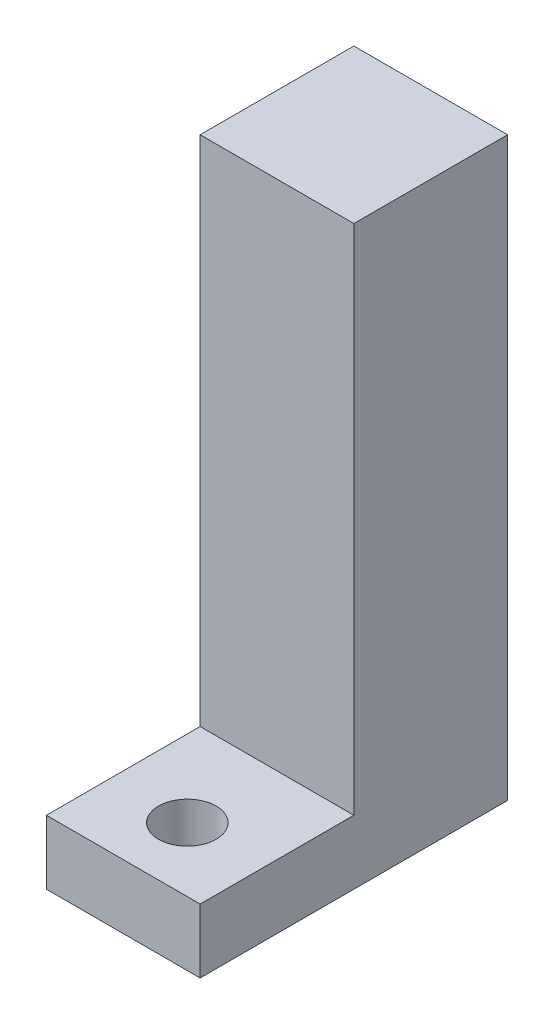
ISO-10303-21;
HEADER;
FILE_DESCRIPTION(('STEP AP214'),'2;1');
FILE_NAME('part.step','',(''),(''),'','','');
FILE_SCHEMA(('AUTOMOTIVE_DESIGN { 1 0 10303 214 1 1 1 1 }'));
ENDSEC;
DATA;
#1=APPLICATION_CONTEXT('core data for automotive mechanical design processes');
#2=APPLICATION_PROTOCOL_DEFINITION('international standard','automotive_design',2000,#1);
#3=PRODUCT_CONTEXT('',#1,'mechanical');
#4=PRODUCT('Part','Part','',(#3));
#5=PRODUCT_RELATED_PRODUCT_CATEGORY('part','',(#4));
#6=PRODUCT_DEFINITION_FORMATION('','',#4);
#7=PRODUCT_DEFINITION_CONTEXT('part definition',#1,'design');
#8=PRODUCT_DEFINITION('design','',#6,#7);
#9=PRODUCT_DEFINITION_SHAPE('','',#8);
#10=(LENGTH_UNIT() NAMED_UNIT(*) SI_UNIT(.MILLI.,.METRE.));
#11=(NAMED_UNIT(*) PLANE_ANGLE_UNIT() SI_UNIT($,.RADIAN.));
#12=(NAMED_UNIT(*) SI_UNIT($,.STERADIAN.) SOLID_ANGLE_UNIT());
#13=UNCERTAINTY_MEASURE_WITH_UNIT(LENGTH_MEASURE(1.E-05),#10,'distance_accuracy_value','');
#14=(GEOMETRIC_REPRESENTATION_CONTEXT(3) GLOBAL_UNCERTAINTY_ASSIGNED_CONTEXT((#13)) GLOBAL_UNIT_ASSIGNED_CONTEXT((#10,
#11,#12)) REPRESENTATION_CONTEXT('',''));
#15=CARTESIAN_POINT('',(0.,0.,0.));
#16=DIRECTION('',(0.,0.,1.));
#17=DIRECTION('',(1.,0.,0.));
#18=AXIS2_PLACEMENT_3D('',#15,#16,#17);
#19=CARTESIAN_POINT('',(-6.,0.,-6.));
#20=DIRECTION('',(1.,0.,0.));
#21=DIRECTION('',(0.,0.,-1.));
#22=AXIS2_PLACEMENT_3D('',#19,#20,#21);
#23=PLANE('',#22);
#24=DIRECTION('',(0.,0.,1.));
#25=VECTOR('',#24,1.);
#26=CARTESIAN_POINT('',(-6.,-45.,-6.));
#27=LINE('',#26,#25);
#28=CARTESIAN_POINT('',(-6.,-45.,-6.));
#29=VERTEX_POINT('',#28);
#30=CARTESIAN_POINT('',(-6.,-45.,18.));
#31=VERTEX_POINT('',#30);
#32=EDGE_CURVE('E130',#29,#31,#27,.T.);
#33=ORIENTED_EDGE('',*,*,#32,.T.);
#34=DIRECTION('',(0.,-1.,0.));
#35=VECTOR('',#34,1.);
#36=CARTESIAN_POINT('',(-6.,-40.,18.));
#37=LINE('',#36,#35);
#38=CARTESIAN_POINT('',(-6.,-40.,18.));
#39=VERTEX_POINT('',#38);
#40=EDGE_CURVE('E121',#39,#31,#37,.T.);
#41=ORIENTED_EDGE('',*,*,#40,.F.);
#42=DIRECTION('',(0.,0.,1.));
#43=VECTOR('',#42,1.);
#44=CARTESIAN_POINT('',(-6.,-40.,0.));
#45=LINE('',#44,#43);
#46=CARTESIAN_POINT('',(-6.,-40.,6.));
#47=VERTEX_POINT('',#46);
#48=EDGE_CURVE('E106',#47,#39,#45,.T.);
#49=ORIENTED_EDGE('',*,*,#48,.F.);
#50=DIRECTION('',(0.,-1.,0.));
#51=VECTOR('',#50,1.);
#52=CARTESIAN_POINT('',(-6.,0.,6.));
#53=LINE('',#52,#51);
#54=CARTESIAN_POINT('',(-6.,0.,6.));
#55=VERTEX_POINT('',#54);
#56=EDGE_CURVE('E53',#55,#47,#53,.T.);
#57=ORIENTED_EDGE('',*,*,#56,.F.);
#58=DIRECTION('',(0.,0.,1.));
#59=VECTOR('',#58,1.);
#60=CARTESIAN_POINT('',(-6.,0.,-6.));
#61=LINE('',#60,#59);
#62=CARTESIAN_POINT('',(-6.,0.,-6.));
#63=VERTEX_POINT('',#62);
#64=EDGE_CURVE('E139',#63,#55,#61,.T.);
#65=ORIENTED_EDGE('',*,*,#64,.F.);
#66=DIRECTION('',(0.,-1.,0.));
#67=VECTOR('',#66,1.);
#68=CARTESIAN_POINT('',(-6.,0.,-6.));
#69=LINE('',#68,#67);
#70=EDGE_CURVE('E150',#63,#29,#69,.T.);
#71=ORIENTED_EDGE('',*,*,#70,.T.);
#72=EDGE_LOOP('',(#33,#41,#49,#57,#65,#71));
#73=FACE_BOUND('',#72,.T.);
#74=ADVANCED_FACE('F44',(#73),#23,.F.);
#75=CARTESIAN_POINT('',(-6.,0.,6.));
#76=DIRECTION('',(0.,0.,-1.));
#77=DIRECTION('',(-1.,0.,0.));
#78=AXIS2_PLACEMENT_3D('',#75,#76,#77);
#79=PLANE('',#78);
#80=ORIENTED_EDGE('',*,*,#56,.T.);
#81=DIRECTION('',(1.,0.,0.));
#82=VECTOR('',#81,1.);
#83=CARTESIAN_POINT('',(-6.,-40.,6.));
#84=LINE('',#83,#82);
#85=CARTESIAN_POINT('',(6.,-40.,6.));
#86=VERTEX_POINT('',#85);
#87=EDGE_CURVE('E11',#47,#86,#84,.T.);
#88=ORIENTED_EDGE('',*,*,#87,.T.);
#89=DIRECTION('',(0.,-1.,0.));
#90=VECTOR('',#89,1.);
#91=CARTESIAN_POINT('',(6.,0.,6.));
#92=LINE('',#91,#90);
#93=CARTESIAN_POINT('',(6.,0.,6.));
#94=VERTEX_POINT('',#93);
#95=EDGE_CURVE('E158',#94,#86,#92,.T.);
#96=ORIENTED_EDGE('',*,*,#95,.F.);
#97=DIRECTION('',(1.,0.,0.));
#98=VECTOR('',#97,1.);
#99=CARTESIAN_POINT('',(-6.,0.,6.));
#100=LINE('',#99,#98);
#101=EDGE_CURVE('E95',#55,#94,#100,.T.);
#102=ORIENTED_EDGE('',*,*,#101,.F.);
#103=EDGE_LOOP('',(#80,#88,#96,#102));
#104=FACE_BOUND('',#103,.T.);
#105=ADVANCED_FACE('F162',(#104),#79,.F.);
#106=CARTESIAN_POINT('',(6.,0.,6.));
#107=DIRECTION('',(-1.,0.,0.));
#108=DIRECTION('',(0.,0.,1.));
#109=AXIS2_PLACEMENT_3D('',#106,#107,#108);
#110=PLANE('',#109);
#111=DIRECTION('',(0.,0.,-1.));
#112=VECTOR('',#111,1.);
#113=CARTESIAN_POINT('',(6.,-45.,6.));
#114=LINE('',#113,#112);
#115=CARTESIAN_POINT('',(6.,-45.,18.));
#116=VERTEX_POINT('',#115);
#117=CARTESIAN_POINT('',(6.,-45.,-6.));
#118=VERTEX_POINT('',#117);
#119=EDGE_CURVE('E132',#116,#118,#114,.T.);
#120=ORIENTED_EDGE('',*,*,#119,.T.);
#121=DIRECTION('',(0.,-1.,0.));
#122=VECTOR('',#121,1.);
#123=CARTESIAN_POINT('',(6.,0.,-6.));
#124=LINE('',#123,#122);
#125=CARTESIAN_POINT('',(6.,0.,-6.));
#126=VERTEX_POINT('',#125);
#127=EDGE_CURVE('E154',#126,#118,#124,.T.);
#128=ORIENTED_EDGE('',*,*,#127,.F.);
#129=DIRECTION('',(0.,0.,-1.));
#130=VECTOR('',#129,1.);
#131=CARTESIAN_POINT('',(6.,0.,6.));
#132=LINE('',#131,#130);
#133=EDGE_CURVE('E141',#94,#126,#132,.T.);
#134=ORIENTED_EDGE('',*,*,#133,.F.);
#135=ORIENTED_EDGE('',*,*,#95,.T.);
#136=DIRECTION('',(0.,0.,-1.));
#137=VECTOR('',#136,1.);
#138=CARTESIAN_POINT('',(6.,-40.,18.));
#139=LINE('',#138,#137);
#140=CARTESIAN_POINT('',(6.,-40.,18.));
#141=VERTEX_POINT('',#140);
#142=EDGE_CURVE('E61',#141,#86,#139,.T.);
#143=ORIENTED_EDGE('',*,*,#142,.F.);
#144=DIRECTION('',(0.,-1.,0.));
#145=VECTOR('',#144,1.);
#146=CARTESIAN_POINT('',(6.,-40.,18.));
#147=LINE('',#146,#145);
#148=EDGE_CURVE('E124',#141,#116,#147,.T.);
#149=ORIENTED_EDGE('',*,*,#148,.T.);
#150=EDGE_LOOP('',(#120,#128,#134,#135,#143,#149));
#151=FACE_BOUND('',#150,.T.);
#152=ADVANCED_FACE('F166',(#151),#110,.F.);
#153=CARTESIAN_POINT('',(6.,0.,-6.));
#154=DIRECTION('',(0.,0.,1.));
#155=DIRECTION('',(1.,0.,0.));
#156=AXIS2_PLACEMENT_3D('',#153,#154,#155);
#157=PLANE('',#156);
#158=DIRECTION('',(-1.,0.,0.));
#159=VECTOR('',#158,1.);
#160=CARTESIAN_POINT('',(6.,-45.,-6.));
#161=LINE('',#160,#159);
#162=EDGE_CURVE('E83',#118,#29,#161,.T.);
#163=ORIENTED_EDGE('',*,*,#162,.T.);
#164=ORIENTED_EDGE('',*,*,#70,.F.);
#165=DIRECTION('',(-1.,0.,0.));
#166=VECTOR('',#165,1.);
#167=CARTESIAN_POINT('',(6.,0.,-6.));
#168=LINE('',#167,#166);
#169=EDGE_CURVE('E68',#126,#63,#168,.T.);
#170=ORIENTED_EDGE('',*,*,#169,.F.);
#171=ORIENTED_EDGE('',*,*,#127,.T.);
#172=EDGE_LOOP('',(#163,#164,#170,#171));
#173=FACE_BOUND('',#172,.T.);
#174=ADVANCED_FACE('F168',(#173),#157,.F.);
#175=CARTESIAN_POINT('',(0.,0.,0.));
#176=DIRECTION('',(0.,1.,0.));
#177=DIRECTION('',(0.,0.,1.));
#178=AXIS2_PLACEMENT_3D('',#175,#176,#177);
#179=PLANE('',#178);
#180=ORIENTED_EDGE('',*,*,#64,.T.);
#181=ORIENTED_EDGE('',*,*,#101,.T.);
#182=ORIENTED_EDGE('',*,*,#133,.T.);
#183=ORIENTED_EDGE('',*,*,#169,.T.);
#184=EDGE_LOOP('',(#180,#181,#182,#183));
#185=FACE_BOUND('',#184,.T.);
#186=ADVANCED_FACE('F164',(#185),#179,.T.);
#187=CARTESIAN_POINT('',(0.,-45.,0.));
#188=DIRECTION('',(0.,1.,0.));
#189=DIRECTION('',(0.,0.,1.));
#190=AXIS2_PLACEMENT_3D('',#187,#188,#189);
#191=PLANE('',#190);
#192=CARTESIAN_POINT('',(0.,-45.,13.));
#193=DIRECTION('',(0.,1.,0.));
#194=DIRECTION('',(0.,0.,1.));
#195=AXIS2_PLACEMENT_3D('',#192,#193,#194);
#196=CIRCLE('',#195,2.25);
#197=CARTESIAN_POINT('',(0.,-45.,15.25));
#198=VERTEX_POINT('',#197);
#199=EDGE_CURVE('E257',#198,#198,#196,.F.);
#200=ORIENTED_EDGE('',*,*,#199,.F.);
#201=EDGE_LOOP('',(#200));
#202=FACE_BOUND('',#201,.T.);
#203=ORIENTED_EDGE('',*,*,#162,.F.);
#204=ORIENTED_EDGE('',*,*,#119,.F.);
#205=DIRECTION('',(1.,0.,0.));
#206=VECTOR('',#205,1.);
#207=CARTESIAN_POINT('',(-6.,-45.,18.));
#208=LINE('',#207,#206);
#209=EDGE_CURVE('E113',#31,#116,#208,.T.);
#210=ORIENTED_EDGE('',*,*,#209,.F.);
#211=ORIENTED_EDGE('',*,*,#32,.F.);
#212=EDGE_LOOP('',(#203,#204,#210,#211));
#213=FACE_BOUND('',#212,.T.);
#214=ADVANCED_FACE('F176',(#202,#213),#191,.F.);
#215=CARTESIAN_POINT('',(0.,-40.,0.));
#216=DIRECTION('',(0.,1.,0.));
#217=DIRECTION('',(0.,0.,1.));
#218=AXIS2_PLACEMENT_3D('',#215,#216,#217);
#219=PLANE('',#218);
#220=CARTESIAN_POINT('',(0.,-40.,13.));
#221=DIRECTION('',(0.,1.,0.));
#222=DIRECTION('',(0.,0.,1.));
#223=AXIS2_PLACEMENT_3D('',#220,#221,#222);
#224=CIRCLE('',#223,2.25);
#225=CARTESIAN_POINT('',(0.,-40.,15.25));
#226=VERTEX_POINT('',#225);
#227=EDGE_CURVE('E48',#226,#226,#224,.F.);
#228=ORIENTED_EDGE('',*,*,#227,.T.);
#229=EDGE_LOOP('',(#228));
#230=FACE_BOUND('',#229,.T.);
#231=ORIENTED_EDGE('',*,*,#87,.F.);
#232=ORIENTED_EDGE('',*,*,#48,.T.);
#233=DIRECTION('',(1.,0.,0.));
#234=VECTOR('',#233,1.);
#235=CARTESIAN_POINT('',(-6.,-40.,18.));
#236=LINE('',#235,#234);
#237=EDGE_CURVE('E108',#39,#141,#236,.T.);
#238=ORIENTED_EDGE('',*,*,#237,.T.);
#239=ORIENTED_EDGE('',*,*,#142,.T.);
#240=EDGE_LOOP('',(#231,#232,#238,#239));
#241=FACE_BOUND('',#240,.T.);
#242=ADVANCED_FACE('F107',(#230,#241),#219,.T.);
#243=CARTESIAN_POINT('',(-6.,-40.,18.));
#244=DIRECTION('',(0.,0.,-1.));
#245=DIRECTION('',(-1.,0.,0.));
#246=AXIS2_PLACEMENT_3D('',#243,#244,#245);
#247=PLANE('',#246);
#248=ORIENTED_EDGE('',*,*,#209,.T.);
#249=ORIENTED_EDGE('',*,*,#148,.F.);
#250=ORIENTED_EDGE('',*,*,#237,.F.);
#251=ORIENTED_EDGE('',*,*,#40,.T.);
#252=EDGE_LOOP('',(#248,#249,#250,#251));
#253=FACE_BOUND('',#252,.T.);
#254=ADVANCED_FACE('F119',(#253),#247,.F.);
#255=CARTESIAN_POINT('',(0.,-39.5,13.));
#256=DIRECTION('',(0.,-1.,0.));
#257=DIRECTION('',(0.,0.,-1.));
#258=AXIS2_PLACEMENT_3D('',#255,#256,#257);
#259=CYLINDRICAL_SURFACE('',#258,2.25);
#260=ORIENTED_EDGE('',*,*,#227,.F.);
#261=EDGE_LOOP('',(#260));
#262=FACE_BOUND('',#261,.T.);
#263=ORIENTED_EDGE('',*,*,#199,.T.);
#264=EDGE_LOOP('',(#263));
#265=FACE_BOUND('',#264,.T.);
#266=ADVANCED_FACE('F203',(#262,#265),#259,.F.);
#267=CLOSED_SHELL('',(#74,#105,#152,#174,#186,#214,#242,#254,#266));
#268=MANIFOLD_SOLID_BREP('B2',#267);
#269=ADVANCED_BREP_SHAPE_REPRESENTATION('',(#18,#268),#14);
#270=SHAPE_DEFINITION_REPRESENTATION(#9,#269);
ENDSEC;
END-ISO-10303-21;
